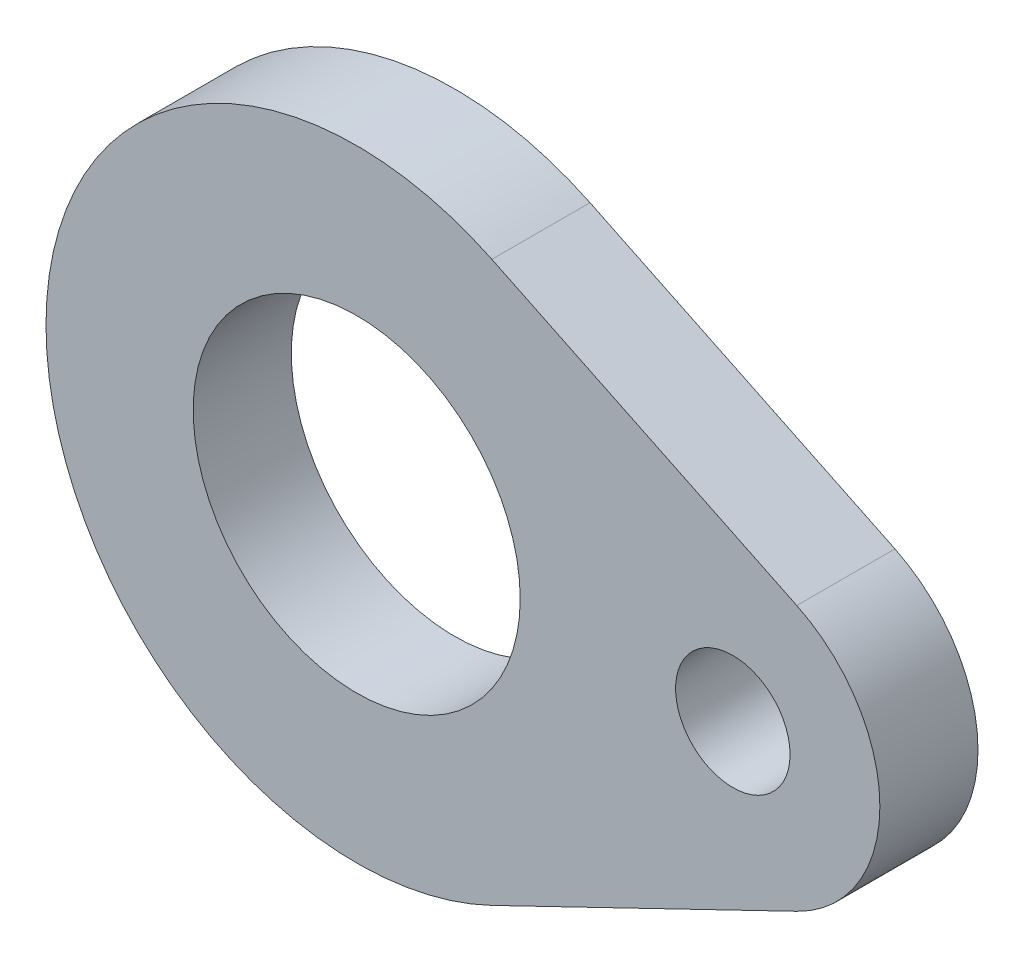
ISO-10303-21;
HEADER;
FILE_DESCRIPTION(('STEP AP214'),'2;1');
FILE_NAME('part.step','',(''),(''),'','','');
FILE_SCHEMA(('AUTOMOTIVE_DESIGN { 1 0 10303 214 1 1 1 1 }'));
ENDSEC;
DATA;
#1=APPLICATION_CONTEXT('core data for automotive mechanical design processes');
#2=APPLICATION_PROTOCOL_DEFINITION('international standard','automotive_design',2000,#1);
#3=PRODUCT_CONTEXT('',#1,'mechanical');
#4=PRODUCT('Part','Part','',(#3));
#5=PRODUCT_RELATED_PRODUCT_CATEGORY('part','',(#4));
#6=PRODUCT_DEFINITION_FORMATION('','',#4);
#7=PRODUCT_DEFINITION_CONTEXT('part definition',#1,'design');
#8=PRODUCT_DEFINITION('design','',#6,#7);
#9=PRODUCT_DEFINITION_SHAPE('','',#8);
#10=(LENGTH_UNIT() NAMED_UNIT(*) SI_UNIT(.MILLI.,.METRE.));
#11=(NAMED_UNIT(*) PLANE_ANGLE_UNIT() SI_UNIT($,.RADIAN.));
#12=(NAMED_UNIT(*) SI_UNIT($,.STERADIAN.) SOLID_ANGLE_UNIT());
#13=UNCERTAINTY_MEASURE_WITH_UNIT(LENGTH_MEASURE(1.E-05),#10,'distance_accuracy_value','');
#14=(GEOMETRIC_REPRESENTATION_CONTEXT(3) GLOBAL_UNCERTAINTY_ASSIGNED_CONTEXT((#13)) GLOBAL_UNIT_ASSIGNED_CONTEXT((#10,
#11,#12)) REPRESENTATION_CONTEXT('',''));
#15=CARTESIAN_POINT('',(0.,0.,0.));
#16=DIRECTION('',(0.,0.,1.));
#17=DIRECTION('',(1.,0.,0.));
#18=AXIS2_PLACEMENT_3D('',#15,#16,#17);
#19=CARTESIAN_POINT('',(11.5,0.,1.5));
#20=DIRECTION('',(0.,0.,1.));
#21=DIRECTION('',(1.,0.,0.));
#22=AXIS2_PLACEMENT_3D('',#19,#20,#21);
#23=PLANE('',#22);
#24=CARTESIAN_POINT('',(0.,0.,1.5));
#25=DIRECTION('',(0.,0.,1.));
#26=DIRECTION('',(1.,0.,0.));
#27=AXIS2_PLACEMENT_3D('',#24,#25,#26);
#28=CIRCLE('',#27,5.);
#29=CARTESIAN_POINT('',(5.,0.,1.5));
#30=VERTEX_POINT('',#29);
#31=EDGE_CURVE('E104',#30,#30,#28,.T.);
#32=ORIENTED_EDGE('',*,*,#31,.F.);
#33=EDGE_LOOP('',(#32));
#34=FACE_BOUND('',#33,.T.);
#35=CARTESIAN_POINT('',(11.5,0.,1.5));
#36=DIRECTION('',(0.,0.,1.));
#37=DIRECTION('',(1.,0.,0.));
#38=AXIS2_PLACEMENT_3D('',#35,#36,#37);
#39=CIRCLE('',#38,4.49663097814814);
#40=CARTESIAN_POINT('',(13.4563742729362,-4.0487392924014,1.5));
#41=VERTEX_POINT('',#40);
#42=CARTESIAN_POINT('',(13.4563742729362,4.0487392924014,1.5));
#43=VERTEX_POINT('',#42);
#44=EDGE_CURVE('E89',#41,#43,#39,.T.);
#45=ORIENTED_EDGE('',*,*,#44,.T.);
#46=DIRECTION('',(-0.900393942059441,0.435075567117553,0.));
#47=VECTOR('',#46,1.);
#48=CARTESIAN_POINT('',(4.13321788761675,8.55374244956469,1.5));
#49=LINE('',#48,#47);
#50=CARTESIAN_POINT('',(4.13321788761675,8.55374244956469,1.5));
#51=VERTEX_POINT('',#50);
#52=EDGE_CURVE('E84',#43,#51,#49,.T.);
#53=ORIENTED_EDGE('',*,*,#52,.T.);
#54=CARTESIAN_POINT('',(0.,0.,1.5));
#55=DIRECTION('',(0.,0.,1.));
#56=DIRECTION('',(1.,0.,0.));
#57=AXIS2_PLACEMENT_3D('',#54,#55,#56);
#58=CIRCLE('',#57,9.5);
#59=CARTESIAN_POINT('',(4.13321788761675,-8.55374244956469,1.5));
#60=VERTEX_POINT('',#59);
#61=EDGE_CURVE('E87',#51,#60,#58,.T.);
#62=ORIENTED_EDGE('',*,*,#61,.T.);
#63=DIRECTION('',(0.900393942059441,0.435075567117553,0.));
#64=VECTOR('',#63,1.);
#65=CARTESIAN_POINT('',(4.13321788761675,-8.55374244956469,1.5));
#66=LINE('',#65,#64);
#67=EDGE_CURVE('E54',#60,#41,#66,.T.);
#68=ORIENTED_EDGE('',*,*,#67,.T.);
#69=EDGE_LOOP('',(#45,#53,#62,#68));
#70=FACE_BOUND('',#69,.T.);
#71=CARTESIAN_POINT('',(11.5,0.,1.5));
#72=DIRECTION('',(0.,0.,1.));
#73=DIRECTION('',(1.,0.,0.));
#74=AXIS2_PLACEMENT_3D('',#71,#72,#73);
#75=CIRCLE('',#74,1.75);
#76=CARTESIAN_POINT('',(13.25,0.,1.5));
#77=VERTEX_POINT('',#76);
#78=EDGE_CURVE('E119',#77,#77,#75,.T.);
#79=ORIENTED_EDGE('',*,*,#78,.F.);
#80=EDGE_LOOP('',(#79));
#81=FACE_BOUND('',#80,.T.);
#82=ADVANCED_FACE('F37',(#34,#70,#81),#23,.T.);
#83=CARTESIAN_POINT('',(11.5,0.,-1.5));
#84=DIRECTION('',(0.,0.,1.));
#85=DIRECTION('',(1.,0.,0.));
#86=AXIS2_PLACEMENT_3D('',#83,#84,#85);
#87=PLANE('',#86);
#88=CARTESIAN_POINT('',(11.5,0.,-1.5));
#89=DIRECTION('',(0.,0.,1.));
#90=DIRECTION('',(1.,0.,0.));
#91=AXIS2_PLACEMENT_3D('',#88,#89,#90);
#92=CIRCLE('',#91,4.49663097814814);
#93=CARTESIAN_POINT('',(13.4563742729362,-4.0487392924014,-1.5));
#94=VERTEX_POINT('',#93);
#95=CARTESIAN_POINT('',(13.4563742729362,4.0487392924014,-1.5));
#96=VERTEX_POINT('',#95);
#97=EDGE_CURVE('E101',#94,#96,#92,.T.);
#98=ORIENTED_EDGE('',*,*,#97,.F.);
#99=DIRECTION('',(0.900393942059441,0.435075567117553,0.));
#100=VECTOR('',#99,1.);
#101=CARTESIAN_POINT('',(4.13321788761675,-8.55374244956469,-1.5));
#102=LINE('',#101,#100);
#103=CARTESIAN_POINT('',(4.13321788761675,-8.55374244956469,-1.5));
#104=VERTEX_POINT('',#103);
#105=EDGE_CURVE('E77',#104,#94,#102,.T.);
#106=ORIENTED_EDGE('',*,*,#105,.F.);
#107=CARTESIAN_POINT('',(0.,0.,-1.5));
#108=DIRECTION('',(0.,0.,1.));
#109=DIRECTION('',(1.,0.,0.));
#110=AXIS2_PLACEMENT_3D('',#107,#108,#109);
#111=CIRCLE('',#110,9.5);
#112=CARTESIAN_POINT('',(4.13321788761675,8.55374244956469,-1.5));
#113=VERTEX_POINT('',#112);
#114=EDGE_CURVE('E71',#113,#104,#111,.T.);
#115=ORIENTED_EDGE('',*,*,#114,.F.);
#116=DIRECTION('',(-0.900393942059441,0.435075567117553,0.));
#117=VECTOR('',#116,1.);
#118=CARTESIAN_POINT('',(4.13321788761675,8.55374244956469,-1.5));
#119=LINE('',#118,#117);
#120=EDGE_CURVE('E93',#96,#113,#119,.T.);
#121=ORIENTED_EDGE('',*,*,#120,.F.);
#122=EDGE_LOOP('',(#98,#106,#115,#121));
#123=FACE_BOUND('',#122,.T.);
#124=CARTESIAN_POINT('',(0.,0.,-1.5));
#125=DIRECTION('',(0.,0.,1.));
#126=DIRECTION('',(1.,0.,0.));
#127=AXIS2_PLACEMENT_3D('',#124,#125,#126);
#128=CIRCLE('',#127,5.);
#129=CARTESIAN_POINT('',(5.,0.,-1.5));
#130=VERTEX_POINT('',#129);
#131=EDGE_CURVE('E116',#130,#130,#128,.T.);
#132=ORIENTED_EDGE('',*,*,#131,.T.);
#133=EDGE_LOOP('',(#132));
#134=FACE_BOUND('',#133,.T.);
#135=CARTESIAN_POINT('',(11.5,0.,-1.5));
#136=DIRECTION('',(0.,0.,1.));
#137=DIRECTION('',(1.,0.,0.));
#138=AXIS2_PLACEMENT_3D('',#135,#136,#137);
#139=CIRCLE('',#138,1.75);
#140=CARTESIAN_POINT('',(13.25,0.,-1.5));
#141=VERTEX_POINT('',#140);
#142=EDGE_CURVE('E122',#141,#141,#139,.T.);
#143=ORIENTED_EDGE('',*,*,#142,.T.);
#144=EDGE_LOOP('',(#143));
#145=FACE_BOUND('',#144,.T.);
#146=ADVANCED_FACE('F112',(#123,#134,#145),#87,.F.);
#147=CARTESIAN_POINT('',(11.5,0.,1.5));
#148=DIRECTION('',(0.,0.,-1.));
#149=DIRECTION('',(-1.,0.,0.));
#150=AXIS2_PLACEMENT_3D('',#147,#148,#149);
#151=CYLINDRICAL_SURFACE('',#150,4.49663097814814);
#152=ORIENTED_EDGE('',*,*,#97,.T.);
#153=DIRECTION('',(0.,0.,-1.));
#154=VECTOR('',#153,1.);
#155=CARTESIAN_POINT('',(13.4563742729362,4.0487392924014,1.5));
#156=LINE('',#155,#154);
#157=EDGE_CURVE('E11',#43,#96,#156,.T.);
#158=ORIENTED_EDGE('',*,*,#157,.F.);
#159=ORIENTED_EDGE('',*,*,#44,.F.);
#160=DIRECTION('',(0.,0.,-1.));
#161=VECTOR('',#160,1.);
#162=CARTESIAN_POINT('',(13.4563742729362,-4.0487392924014,1.5));
#163=LINE('',#162,#161);
#164=EDGE_CURVE('E97',#41,#94,#163,.T.);
#165=ORIENTED_EDGE('',*,*,#164,.T.);
#166=EDGE_LOOP('',(#152,#158,#159,#165));
#167=FACE_BOUND('',#166,.T.);
#168=ADVANCED_FACE('F39',(#167),#151,.T.);
#169=CARTESIAN_POINT('',(4.13321788761675,8.55374244956469,1.5));
#170=DIRECTION('',(-0.435075567117553,-0.900393942059441,0.));
#171=DIRECTION('',(0.900393942059441,-0.435075567117553,0.));
#172=AXIS2_PLACEMENT_3D('',#169,#170,#171);
#173=PLANE('',#172);
#174=ORIENTED_EDGE('',*,*,#120,.T.);
#175=DIRECTION('',(0.,0.,-1.));
#176=VECTOR('',#175,1.);
#177=CARTESIAN_POINT('',(4.13321788761675,8.55374244956469,1.5));
#178=LINE('',#177,#176);
#179=EDGE_CURVE('E46',#51,#113,#178,.T.);
#180=ORIENTED_EDGE('',*,*,#179,.F.);
#181=ORIENTED_EDGE('',*,*,#52,.F.);
#182=ORIENTED_EDGE('',*,*,#157,.T.);
#183=EDGE_LOOP('',(#174,#180,#181,#182));
#184=FACE_BOUND('',#183,.T.);
#185=ADVANCED_FACE('F92',(#184),#173,.F.);
#186=CARTESIAN_POINT('',(0.,0.,1.5));
#187=DIRECTION('',(0.,0.,-1.));
#188=DIRECTION('',(-1.,0.,0.));
#189=AXIS2_PLACEMENT_3D('',#186,#187,#188);
#190=CYLINDRICAL_SURFACE('',#189,9.5);
#191=ORIENTED_EDGE('',*,*,#114,.T.);
#192=DIRECTION('',(0.,0.,-1.));
#193=VECTOR('',#192,1.);
#194=CARTESIAN_POINT('',(4.13321788761675,-8.55374244956469,1.5));
#195=LINE('',#194,#193);
#196=EDGE_CURVE('E94',#60,#104,#195,.T.);
#197=ORIENTED_EDGE('',*,*,#196,.F.);
#198=ORIENTED_EDGE('',*,*,#61,.F.);
#199=ORIENTED_EDGE('',*,*,#179,.T.);
#200=EDGE_LOOP('',(#191,#197,#198,#199));
#201=FACE_BOUND('',#200,.T.);
#202=ADVANCED_FACE('F95',(#201),#190,.T.);
#203=CARTESIAN_POINT('',(4.13321788761675,-8.55374244956469,1.5));
#204=DIRECTION('',(-0.435075567117553,0.900393942059441,0.));
#205=DIRECTION('',(-0.900393942059441,-0.435075567117553,0.));
#206=AXIS2_PLACEMENT_3D('',#203,#204,#205);
#207=PLANE('',#206);
#208=ORIENTED_EDGE('',*,*,#105,.T.);
#209=ORIENTED_EDGE('',*,*,#164,.F.);
#210=ORIENTED_EDGE('',*,*,#67,.F.);
#211=ORIENTED_EDGE('',*,*,#196,.T.);
#212=EDGE_LOOP('',(#208,#209,#210,#211));
#213=FACE_BOUND('',#212,.T.);
#214=ADVANCED_FACE('F109',(#213),#207,.F.);
#215=CARTESIAN_POINT('',(0.,0.,1.5));
#216=DIRECTION('',(0.,0.,-1.));
#217=DIRECTION('',(-1.,0.,0.));
#218=AXIS2_PLACEMENT_3D('',#215,#216,#217);
#219=CYLINDRICAL_SURFACE('',#218,5.);
#220=ORIENTED_EDGE('',*,*,#31,.T.);
#221=EDGE_LOOP('',(#220));
#222=FACE_BOUND('',#221,.T.);
#223=ORIENTED_EDGE('',*,*,#131,.F.);
#224=EDGE_LOOP('',(#223));
#225=FACE_BOUND('',#224,.T.);
#226=ADVANCED_FACE('F139',(#222,#225),#219,.F.);
#227=CARTESIAN_POINT('',(11.5,0.,1.5));
#228=DIRECTION('',(0.,0.,-1.));
#229=DIRECTION('',(-1.,0.,0.));
#230=AXIS2_PLACEMENT_3D('',#227,#228,#229);
#231=CYLINDRICAL_SURFACE('',#230,1.75);
#232=ORIENTED_EDGE('',*,*,#78,.T.);
#233=EDGE_LOOP('',(#232));
#234=FACE_BOUND('',#233,.T.);
#235=ORIENTED_EDGE('',*,*,#142,.F.);
#236=EDGE_LOOP('',(#235));
#237=FACE_BOUND('',#236,.T.);
#238=ADVANCED_FACE('F128',(#234,#237),#231,.F.);
#239=CLOSED_SHELL('',(#82,#146,#168,#185,#202,#214,#226,#238));
#240=MANIFOLD_SOLID_BREP('B2',#239);
#241=ADVANCED_BREP_SHAPE_REPRESENTATION('',(#18,#240),#14);
#242=SHAPE_DEFINITION_REPRESENTATION(#9,#241);
ENDSEC;
END-ISO-10303-21;
